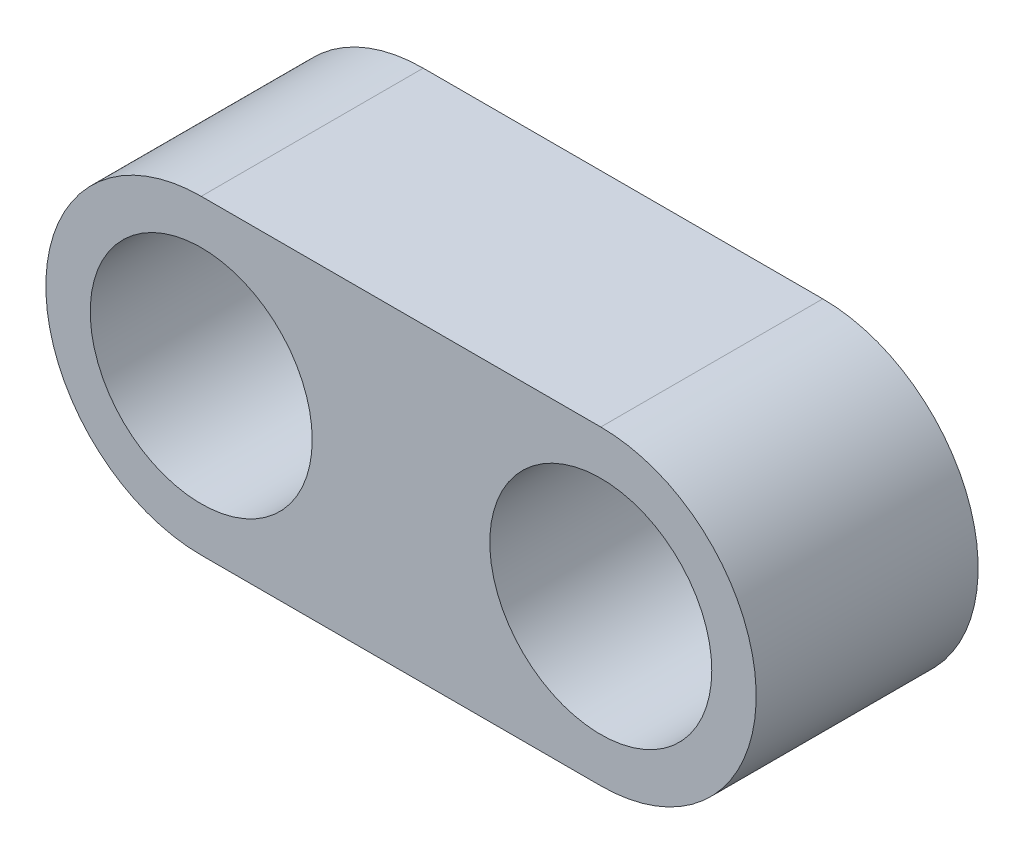
ISO-10303-21;
HEADER;
FILE_DESCRIPTION(('STEP AP214'),'2;1');
FILE_NAME('part.step','',(''),(''),'','','');
FILE_SCHEMA(('AUTOMOTIVE_DESIGN { 1 0 10303 214 1 1 1 1 }'));
ENDSEC;
DATA;
#1=APPLICATION_CONTEXT('core data for automotive mechanical design processes');
#2=APPLICATION_PROTOCOL_DEFINITION('international standard','automotive_design',2000,#1);
#3=PRODUCT_CONTEXT('',#1,'mechanical');
#4=PRODUCT('Part','Part','',(#3));
#5=PRODUCT_RELATED_PRODUCT_CATEGORY('part','',(#4));
#6=PRODUCT_DEFINITION_FORMATION('','',#4);
#7=PRODUCT_DEFINITION_CONTEXT('part definition',#1,'design');
#8=PRODUCT_DEFINITION('design','',#6,#7);
#9=PRODUCT_DEFINITION_SHAPE('','',#8);
#10=(LENGTH_UNIT() NAMED_UNIT(*) SI_UNIT(.MILLI.,.METRE.));
#11=(NAMED_UNIT(*) PLANE_ANGLE_UNIT() SI_UNIT($,.RADIAN.));
#12=(NAMED_UNIT(*) SI_UNIT($,.STERADIAN.) SOLID_ANGLE_UNIT());
#13=UNCERTAINTY_MEASURE_WITH_UNIT(LENGTH_MEASURE(1.E-05),#10,'distance_accuracy_value','');
#14=(GEOMETRIC_REPRESENTATION_CONTEXT(3) GLOBAL_UNCERTAINTY_ASSIGNED_CONTEXT((#13)) GLOBAL_UNIT_ASSIGNED_CONTEXT((#10,
#11,#12)) REPRESENTATION_CONTEXT('',''));
#15=CARTESIAN_POINT('',(0.,0.,0.));
#16=DIRECTION('',(0.,0.,1.));
#17=DIRECTION('',(1.,0.,0.));
#18=AXIS2_PLACEMENT_3D('',#15,#16,#17);
#19=CARTESIAN_POINT('',(-9.,0.,10.));
#20=DIRECTION('',(0.,0.,1.));
#21=DIRECTION('',(1.,0.,0.));
#22=AXIS2_PLACEMENT_3D('',#19,#20,#21);
#23=PLANE('',#22);
#24=CARTESIAN_POINT('',(-9.,0.,10.));
#25=DIRECTION('',(0.,0.,1.));
#26=DIRECTION('',(1.,0.,0.));
#27=AXIS2_PLACEMENT_3D('',#24,#25,#26);
#28=CIRCLE('',#27,5.);
#29=CARTESIAN_POINT('',(-4.,0.,10.));
#30=VERTEX_POINT('',#29);
#31=EDGE_CURVE('E100',#30,#30,#28,.T.);
#32=ORIENTED_EDGE('',*,*,#31,.F.);
#33=EDGE_LOOP('',(#32));
#34=FACE_BOUND('',#33,.T.);
#35=CARTESIAN_POINT('',(-9.,0.,10.));
#36=DIRECTION('',(0.,0.,1.));
#37=DIRECTION('',(1.,0.,0.));
#38=AXIS2_PLACEMENT_3D('',#35,#36,#37);
#39=CIRCLE('',#38,7.);
#40=CARTESIAN_POINT('',(-9.,7.,10.));
#41=VERTEX_POINT('',#40);
#42=CARTESIAN_POINT('',(-9.,-7.,10.));
#43=VERTEX_POINT('',#42);
#44=EDGE_CURVE('E85',#41,#43,#39,.T.);
#45=ORIENTED_EDGE('',*,*,#44,.T.);
#46=DIRECTION('',(1.,0.,0.));
#47=VECTOR('',#46,1.);
#48=CARTESIAN_POINT('',(-9.,-7.,10.));
#49=LINE('',#48,#47);
#50=CARTESIAN_POINT('',(9.,-7.,10.));
#51=VERTEX_POINT('',#50);
#52=EDGE_CURVE('E80',#43,#51,#49,.T.);
#53=ORIENTED_EDGE('',*,*,#52,.T.);
#54=CARTESIAN_POINT('',(9.,0.,10.));
#55=DIRECTION('',(0.,0.,1.));
#56=DIRECTION('',(1.,0.,0.));
#57=AXIS2_PLACEMENT_3D('',#54,#55,#56);
#58=CIRCLE('',#57,7.);
#59=CARTESIAN_POINT('',(9.,7.,10.));
#60=VERTEX_POINT('',#59);
#61=EDGE_CURVE('E83',#51,#60,#58,.T.);
#62=ORIENTED_EDGE('',*,*,#61,.T.);
#63=DIRECTION('',(-1.,0.,0.));
#64=VECTOR('',#63,1.);
#65=CARTESIAN_POINT('',(-9.,7.,10.));
#66=LINE('',#65,#64);
#67=EDGE_CURVE('E50',#60,#41,#66,.T.);
#68=ORIENTED_EDGE('',*,*,#67,.T.);
#69=EDGE_LOOP('',(#45,#53,#62,#68));
#70=FACE_BOUND('',#69,.T.);
#71=CARTESIAN_POINT('',(9.,0.,10.));
#72=DIRECTION('',(0.,0.,1.));
#73=DIRECTION('',(1.,0.,0.));
#74=AXIS2_PLACEMENT_3D('',#71,#72,#73);
#75=CIRCLE('',#74,5.);
#76=CARTESIAN_POINT('',(14.,0.,10.));
#77=VERTEX_POINT('',#76);
#78=EDGE_CURVE('E115',#77,#77,#75,.T.);
#79=ORIENTED_EDGE('',*,*,#78,.F.);
#80=EDGE_LOOP('',(#79));
#81=FACE_BOUND('',#80,.T.);
#82=ADVANCED_FACE('F33',(#34,#70,#81),#23,.T.);
#83=CARTESIAN_POINT('',(-9.,0.,0.));
#84=DIRECTION('',(0.,0.,1.));
#85=DIRECTION('',(1.,0.,0.));
#86=AXIS2_PLACEMENT_3D('',#83,#84,#85);
#87=PLANE('',#86);
#88=CARTESIAN_POINT('',(-9.,0.,0.));
#89=DIRECTION('',(0.,0.,1.));
#90=DIRECTION('',(1.,0.,0.));
#91=AXIS2_PLACEMENT_3D('',#88,#89,#90);
#92=CIRCLE('',#91,7.);
#93=CARTESIAN_POINT('',(-9.,7.,0.));
#94=VERTEX_POINT('',#93);
#95=CARTESIAN_POINT('',(-9.,-7.,0.));
#96=VERTEX_POINT('',#95);
#97=EDGE_CURVE('E97',#94,#96,#92,.T.);
#98=ORIENTED_EDGE('',*,*,#97,.F.);
#99=DIRECTION('',(-1.,0.,0.));
#100=VECTOR('',#99,1.);
#101=CARTESIAN_POINT('',(-9.,7.,0.));
#102=LINE('',#101,#100);
#103=CARTESIAN_POINT('',(9.,7.,0.));
#104=VERTEX_POINT('',#103);
#105=EDGE_CURVE('E73',#104,#94,#102,.T.);
#106=ORIENTED_EDGE('',*,*,#105,.F.);
#107=CARTESIAN_POINT('',(9.,0.,0.));
#108=DIRECTION('',(0.,0.,1.));
#109=DIRECTION('',(1.,0.,0.));
#110=AXIS2_PLACEMENT_3D('',#107,#108,#109);
#111=CIRCLE('',#110,7.);
#112=CARTESIAN_POINT('',(9.,-7.,0.));
#113=VERTEX_POINT('',#112);
#114=EDGE_CURVE('E67',#113,#104,#111,.T.);
#115=ORIENTED_EDGE('',*,*,#114,.F.);
#116=DIRECTION('',(1.,0.,0.));
#117=VECTOR('',#116,1.);
#118=CARTESIAN_POINT('',(-9.,-7.,0.));
#119=LINE('',#118,#117);
#120=EDGE_CURVE('E89',#96,#113,#119,.T.);
#121=ORIENTED_EDGE('',*,*,#120,.F.);
#122=EDGE_LOOP('',(#98,#106,#115,#121));
#123=FACE_BOUND('',#122,.T.);
#124=CARTESIAN_POINT('',(-9.,0.,0.));
#125=DIRECTION('',(0.,0.,1.));
#126=DIRECTION('',(1.,0.,0.));
#127=AXIS2_PLACEMENT_3D('',#124,#125,#126);
#128=CIRCLE('',#127,5.);
#129=CARTESIAN_POINT('',(-4.,0.,0.));
#130=VERTEX_POINT('',#129);
#131=EDGE_CURVE('E112',#130,#130,#128,.T.);
#132=ORIENTED_EDGE('',*,*,#131,.T.);
#133=EDGE_LOOP('',(#132));
#134=FACE_BOUND('',#133,.T.);
#135=CARTESIAN_POINT('',(9.,0.,0.));
#136=DIRECTION('',(0.,0.,1.));
#137=DIRECTION('',(1.,0.,0.));
#138=AXIS2_PLACEMENT_3D('',#135,#136,#137);
#139=CIRCLE('',#138,5.);
#140=CARTESIAN_POINT('',(14.,0.,0.));
#141=VERTEX_POINT('',#140);
#142=EDGE_CURVE('E118',#141,#141,#139,.T.);
#143=ORIENTED_EDGE('',*,*,#142,.T.);
#144=EDGE_LOOP('',(#143));
#145=FACE_BOUND('',#144,.T.);
#146=ADVANCED_FACE('F108',(#123,#134,#145),#87,.F.);
#147=CARTESIAN_POINT('',(-9.,0.,10.));
#148=DIRECTION('',(0.,0.,-1.));
#149=DIRECTION('',(-1.,0.,0.));
#150=AXIS2_PLACEMENT_3D('',#147,#148,#149);
#151=CYLINDRICAL_SURFACE('',#150,7.);
#152=ORIENTED_EDGE('',*,*,#97,.T.);
#153=DIRECTION('',(0.,0.,-1.));
#154=VECTOR('',#153,1.);
#155=CARTESIAN_POINT('',(-9.,-7.,10.));
#156=LINE('',#155,#154);
#157=EDGE_CURVE('E11',#43,#96,#156,.T.);
#158=ORIENTED_EDGE('',*,*,#157,.F.);
#159=ORIENTED_EDGE('',*,*,#44,.F.);
#160=DIRECTION('',(0.,0.,-1.));
#161=VECTOR('',#160,1.);
#162=CARTESIAN_POINT('',(-9.,7.,10.));
#163=LINE('',#162,#161);
#164=EDGE_CURVE('E93',#41,#94,#163,.T.);
#165=ORIENTED_EDGE('',*,*,#164,.T.);
#166=EDGE_LOOP('',(#152,#158,#159,#165));
#167=FACE_BOUND('',#166,.T.);
#168=ADVANCED_FACE('F35',(#167),#151,.T.);
#169=CARTESIAN_POINT('',(-9.,-7.,10.));
#170=DIRECTION('',(0.,1.,0.));
#171=DIRECTION('',(0.,0.,1.));
#172=AXIS2_PLACEMENT_3D('',#169,#170,#171);
#173=PLANE('',#172);
#174=ORIENTED_EDGE('',*,*,#120,.T.);
#175=DIRECTION('',(0.,0.,-1.));
#176=VECTOR('',#175,1.);
#177=CARTESIAN_POINT('',(9.,-7.,10.));
#178=LINE('',#177,#176);
#179=EDGE_CURVE('E42',#51,#113,#178,.T.);
#180=ORIENTED_EDGE('',*,*,#179,.F.);
#181=ORIENTED_EDGE('',*,*,#52,.F.);
#182=ORIENTED_EDGE('',*,*,#157,.T.);
#183=EDGE_LOOP('',(#174,#180,#181,#182));
#184=FACE_BOUND('',#183,.T.);
#185=ADVANCED_FACE('F88',(#184),#173,.F.);
#186=CARTESIAN_POINT('',(9.,0.,10.));
#187=DIRECTION('',(0.,0.,-1.));
#188=DIRECTION('',(-1.,0.,0.));
#189=AXIS2_PLACEMENT_3D('',#186,#187,#188);
#190=CYLINDRICAL_SURFACE('',#189,7.);
#191=ORIENTED_EDGE('',*,*,#114,.T.);
#192=DIRECTION('',(0.,0.,-1.));
#193=VECTOR('',#192,1.);
#194=CARTESIAN_POINT('',(9.,7.,10.));
#195=LINE('',#194,#193);
#196=EDGE_CURVE('E90',#60,#104,#195,.T.);
#197=ORIENTED_EDGE('',*,*,#196,.F.);
#198=ORIENTED_EDGE('',*,*,#61,.F.);
#199=ORIENTED_EDGE('',*,*,#179,.T.);
#200=EDGE_LOOP('',(#191,#197,#198,#199));
#201=FACE_BOUND('',#200,.T.);
#202=ADVANCED_FACE('F91',(#201),#190,.T.);
#203=CARTESIAN_POINT('',(-9.,7.,10.));
#204=DIRECTION('',(0.,-1.,0.));
#205=DIRECTION('',(0.,0.,-1.));
#206=AXIS2_PLACEMENT_3D('',#203,#204,#205);
#207=PLANE('',#206);
#208=ORIENTED_EDGE('',*,*,#105,.T.);
#209=ORIENTED_EDGE('',*,*,#164,.F.);
#210=ORIENTED_EDGE('',*,*,#67,.F.);
#211=ORIENTED_EDGE('',*,*,#196,.T.);
#212=EDGE_LOOP('',(#208,#209,#210,#211));
#213=FACE_BOUND('',#212,.T.);
#214=ADVANCED_FACE('F105',(#213),#207,.F.);
#215=CARTESIAN_POINT('',(-9.,0.,10.));
#216=DIRECTION('',(0.,0.,-1.));
#217=DIRECTION('',(-1.,0.,0.));
#218=AXIS2_PLACEMENT_3D('',#215,#216,#217);
#219=CYLINDRICAL_SURFACE('',#218,5.);
#220=ORIENTED_EDGE('',*,*,#31,.T.);
#221=EDGE_LOOP('',(#220));
#222=FACE_BOUND('',#221,.T.);
#223=ORIENTED_EDGE('',*,*,#131,.F.);
#224=EDGE_LOOP('',(#223));
#225=FACE_BOUND('',#224,.T.);
#226=ADVANCED_FACE('F135',(#222,#225),#219,.F.);
#227=CARTESIAN_POINT('',(9.,0.,10.));
#228=DIRECTION('',(0.,0.,-1.));
#229=DIRECTION('',(-1.,0.,0.));
#230=AXIS2_PLACEMENT_3D('',#227,#228,#229);
#231=CYLINDRICAL_SURFACE('',#230,5.);
#232=ORIENTED_EDGE('',*,*,#78,.T.);
#233=EDGE_LOOP('',(#232));
#234=FACE_BOUND('',#233,.T.);
#235=ORIENTED_EDGE('',*,*,#142,.F.);
#236=EDGE_LOOP('',(#235));
#237=FACE_BOUND('',#236,.T.);
#238=ADVANCED_FACE('F124',(#234,#237),#231,.F.);
#239=CLOSED_SHELL('',(#82,#146,#168,#185,#202,#214,#226,#238));
#240=MANIFOLD_SOLID_BREP('B2',#239);
#241=ADVANCED_BREP_SHAPE_REPRESENTATION('',(#18,#240),#14);
#242=SHAPE_DEFINITION_REPRESENTATION(#9,#241);
ENDSEC;
END-ISO-10303-21;
